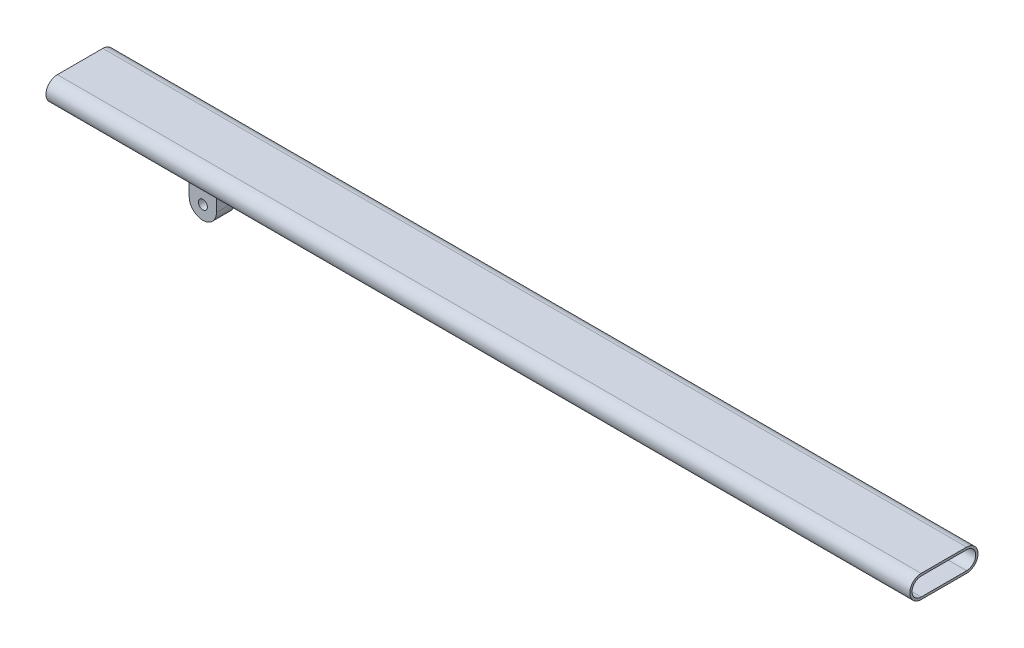
ISO-10303-21;
HEADER;
FILE_DESCRIPTION(('STEP AP214'),'2;1');
FILE_NAME('part.step','',(''),(''),'','','');
FILE_SCHEMA(('AUTOMOTIVE_DESIGN { 1 0 10303 214 1 1 1 1 }'));
ENDSEC;
DATA;
#1=APPLICATION_CONTEXT('core data for automotive mechanical design processes');
#2=APPLICATION_PROTOCOL_DEFINITION('international standard','automotive_design',2000,#1);
#3=PRODUCT_CONTEXT('',#1,'mechanical');
#4=PRODUCT('Part','Part','',(#3));
#5=PRODUCT_RELATED_PRODUCT_CATEGORY('part','',(#4));
#6=PRODUCT_DEFINITION_FORMATION('','',#4);
#7=PRODUCT_DEFINITION_CONTEXT('part definition',#1,'design');
#8=PRODUCT_DEFINITION('design','',#6,#7);
#9=PRODUCT_DEFINITION_SHAPE('','',#8);
#10=(LENGTH_UNIT() NAMED_UNIT(*) SI_UNIT(.MILLI.,.METRE.));
#11=(NAMED_UNIT(*) PLANE_ANGLE_UNIT() SI_UNIT($,.RADIAN.));
#12=(NAMED_UNIT(*) SI_UNIT($,.STERADIAN.) SOLID_ANGLE_UNIT());
#13=UNCERTAINTY_MEASURE_WITH_UNIT(LENGTH_MEASURE(1.E-05),#10,'distance_accuracy_value','');
#14=(GEOMETRIC_REPRESENTATION_CONTEXT(3) GLOBAL_UNCERTAINTY_ASSIGNED_CONTEXT((#13)) GLOBAL_UNIT_ASSIGNED_CONTEXT((#10,
#11,#12)) REPRESENTATION_CONTEXT('',''));
#15=CARTESIAN_POINT('',(0.,0.,0.));
#16=DIRECTION('',(0.,0.,1.));
#17=DIRECTION('',(1.,0.,0.));
#18=AXIS2_PLACEMENT_3D('',#15,#16,#17);
#19=CARTESIAN_POINT('',(73.,-4.5,0.));
#20=DIRECTION('',(0.,-1.,0.));
#21=DIRECTION('',(0.,0.,-1.));
#22=AXIS2_PLACEMENT_3D('',#19,#20,#21);
#23=PLANE('',#22);
#24=CARTESIAN_POINT('',(43.,-4.5,0.));
#25=DIRECTION('',(0.,-1.,0.));
#26=DIRECTION('',(0.,0.,-1.));
#27=AXIS2_PLACEMENT_3D('',#24,#25,#26);
#28=CIRCLE('',#27,0.755649999999997);
#29=CARTESIAN_POINT('',(43.,-4.5,-0.755649999999978));
#30=VERTEX_POINT('',#29);
#31=EDGE_CURVE('E631',#30,#30,#28,.T.);
#32=ORIENTED_EDGE('',*,*,#31,.F.);
#33=EDGE_LOOP('',(#32));
#34=FACE_BOUND('',#33,.T.);
#35=CARTESIAN_POINT('',(73.,-4.5,0.));
#36=DIRECTION('',(0.,-1.,0.));
#37=DIRECTION('',(0.,0.,-1.));
#38=AXIS2_PLACEMENT_3D('',#35,#36,#37);
#39=CIRCLE('',#38,0.755649999999997);
#40=CARTESIAN_POINT('',(73.,-4.5,-0.755649999999993));
#41=VERTEX_POINT('',#40);
#42=EDGE_CURVE('E636',#41,#41,#39,.T.);
#43=ORIENTED_EDGE('',*,*,#42,.F.);
#44=EDGE_LOOP('',(#43));
#45=FACE_BOUND('',#44,.T.);
#46=CARTESIAN_POINT('',(73.,-4.5,0.));
#47=DIRECTION('',(0.,-1.,0.));
#48=DIRECTION('',(0.,0.,-1.));
#49=AXIS2_PLACEMENT_3D('',#46,#47,#48);
#50=CIRCLE('',#49,5.);
#51=CARTESIAN_POINT('',(73.,-4.5,-5.));
#52=VERTEX_POINT('',#51);
#53=CARTESIAN_POINT('',(73.,-4.5,5.));
#54=VERTEX_POINT('',#53);
#55=EDGE_CURVE('E289',#52,#54,#50,.T.);
#56=ORIENTED_EDGE('',*,*,#55,.T.);
#57=DIRECTION('',(-1.,0.,0.));
#58=VECTOR('',#57,1.);
#59=CARTESIAN_POINT('',(73.,-4.5,5.));
#60=LINE('',#59,#58);
#61=CARTESIAN_POINT('',(43.,-4.5,5.00000000000002));
#62=VERTEX_POINT('',#61);
#63=EDGE_CURVE('E293',#54,#62,#60,.T.);
#64=ORIENTED_EDGE('',*,*,#63,.T.);
#65=CARTESIAN_POINT('',(43.,-4.5,0.));
#66=DIRECTION('',(0.,-1.,0.));
#67=DIRECTION('',(0.,0.,-1.));
#68=AXIS2_PLACEMENT_3D('',#65,#66,#67);
#69=CIRCLE('',#68,5.);
#70=CARTESIAN_POINT('',(43.,-4.5,-5.));
#71=VERTEX_POINT('',#70);
#72=EDGE_CURVE('E298',#62,#71,#69,.T.);
#73=ORIENTED_EDGE('',*,*,#72,.T.);
#74=DIRECTION('',(1.,0.,0.));
#75=VECTOR('',#74,1.);
#76=CARTESIAN_POINT('',(73.,-4.5,-5.));
#77=LINE('',#76,#75);
#78=EDGE_CURVE('E302',#71,#52,#77,.T.);
#79=ORIENTED_EDGE('',*,*,#78,.T.);
#80=EDGE_LOOP('',(#56,#64,#73,#79));
#81=FACE_BOUND('',#80,.T.);
#82=DIRECTION('',(1.,0.,0.));
#83=VECTOR('',#82,1.);
#84=CARTESIAN_POINT('',(64.,-4.5,-4.));
#85=LINE('',#84,#83);
#86=CARTESIAN_POINT('',(52.,-4.5,-4.));
#87=VERTEX_POINT('',#86);
#88=CARTESIAN_POINT('',(64.,-4.5,-4.));
#89=VERTEX_POINT('',#88);
#90=EDGE_CURVE('E264',#87,#89,#85,.T.);
#91=ORIENTED_EDGE('',*,*,#90,.F.);
#92=DIRECTION('',(0.,0.,-1.));
#93=VECTOR('',#92,1.);
#94=CARTESIAN_POINT('',(52.,-4.5,-4.));
#95=LINE('',#94,#93);
#96=CARTESIAN_POINT('',(52.,-4.5,4.));
#97=VERTEX_POINT('',#96);
#98=EDGE_CURVE('E260',#97,#87,#95,.T.);
#99=ORIENTED_EDGE('',*,*,#98,.F.);
#100=DIRECTION('',(-1.,0.,0.));
#101=VECTOR('',#100,1.);
#102=CARTESIAN_POINT('',(64.,-4.5,4.));
#103=LINE('',#102,#101);
#104=CARTESIAN_POINT('',(64.,-4.5,4.));
#105=VERTEX_POINT('',#104);
#106=EDGE_CURVE('E272',#105,#97,#103,.T.);
#107=ORIENTED_EDGE('',*,*,#106,.F.);
#108=DIRECTION('',(0.,0.,1.));
#109=VECTOR('',#108,1.);
#110=CARTESIAN_POINT('',(64.,-4.5,-4.));
#111=LINE('',#110,#109);
#112=EDGE_CURVE('E268',#89,#105,#111,.T.);
#113=ORIENTED_EDGE('',*,*,#112,.F.);
#114=EDGE_LOOP('',(#91,#99,#107,#113));
#115=FACE_BOUND('',#114,.T.);
#116=ADVANCED_FACE('F43',(#34,#45,#81,#115),#23,.T.);
#117=CARTESIAN_POINT('',(380.,0.,-10.));
#118=DIRECTION('',(-1.,0.,0.));
#119=DIRECTION('',(0.,0.,1.));
#120=AXIS2_PLACEMENT_3D('',#117,#118,#119);
#121=CYLINDRICAL_SURFACE('',#120,5.);
#122=CARTESIAN_POINT('',(0.,0.,-10.));
#123=DIRECTION('',(1.,0.,0.));
#124=DIRECTION('',(0.,0.,-1.));
#125=AXIS2_PLACEMENT_3D('',#122,#123,#124);
#126=CIRCLE('',#125,5.);
#127=CARTESIAN_POINT('',(0.,-5.,-10.));
#128=VERTEX_POINT('',#127);
#129=CARTESIAN_POINT('',(0.,5.,-10.));
#130=VERTEX_POINT('',#129);
#131=EDGE_CURVE('E323',#128,#130,#126,.T.);
#132=ORIENTED_EDGE('',*,*,#131,.T.);
#133=DIRECTION('',(-1.,0.,0.));
#134=VECTOR('',#133,1.);
#135=CARTESIAN_POINT('',(380.,5.,-10.));
#136=LINE('',#135,#134);
#137=CARTESIAN_POINT('',(380.,5.,-10.));
#138=VERTEX_POINT('',#137);
#139=EDGE_CURVE('E370',#138,#130,#136,.T.);
#140=ORIENTED_EDGE('',*,*,#139,.F.);
#141=CARTESIAN_POINT('',(380.,0.,-10.));
#142=DIRECTION('',(1.,0.,0.));
#143=DIRECTION('',(0.,0.,-1.));
#144=AXIS2_PLACEMENT_3D('',#141,#142,#143);
#145=CIRCLE('',#144,5.);
#146=CARTESIAN_POINT('',(380.,-5.,-10.));
#147=VERTEX_POINT('',#146);
#148=EDGE_CURVE('E333',#147,#138,#145,.T.);
#149=ORIENTED_EDGE('',*,*,#148,.F.);
#150=DIRECTION('',(-1.,0.,0.));
#151=VECTOR('',#150,1.);
#152=CARTESIAN_POINT('',(380.,-5.,-10.));
#153=LINE('',#152,#151);
#154=EDGE_CURVE('E347',#147,#128,#153,.T.);
#155=ORIENTED_EDGE('',*,*,#154,.T.);
#156=EDGE_LOOP('',(#132,#140,#149,#155));
#157=FACE_BOUND('',#156,.T.);
#158=ADVANCED_FACE('F437',(#157),#121,.T.);
#159=CARTESIAN_POINT('',(380.,5.,-10.));
#160=DIRECTION('',(0.,-1.,0.));
#161=DIRECTION('',(0.,0.,-1.));
#162=AXIS2_PLACEMENT_3D('',#159,#160,#161);
#163=PLANE('',#162);
#164=DIRECTION('',(0.,0.,1.));
#165=VECTOR('',#164,1.);
#166=CARTESIAN_POINT('',(0.,5.,-10.));
#167=LINE('',#166,#165);
#168=CARTESIAN_POINT('',(0.,5.,10.));
#169=VERTEX_POINT('',#168);
#170=EDGE_CURVE('E351',#130,#169,#167,.T.);
#171=ORIENTED_EDGE('',*,*,#170,.T.);
#172=DIRECTION('',(-1.,0.,0.));
#173=VECTOR('',#172,1.);
#174=CARTESIAN_POINT('',(380.,5.,10.));
#175=LINE('',#174,#173);
#176=CARTESIAN_POINT('',(380.,5.,10.));
#177=VERTEX_POINT('',#176);
#178=EDGE_CURVE('E366',#177,#169,#175,.T.);
#179=ORIENTED_EDGE('',*,*,#178,.F.);
#180=DIRECTION('',(0.,0.,1.));
#181=VECTOR('',#180,1.);
#182=CARTESIAN_POINT('',(380.,5.,-10.));
#183=LINE('',#182,#181);
#184=EDGE_CURVE('E337',#138,#177,#183,.T.);
#185=ORIENTED_EDGE('',*,*,#184,.F.);
#186=ORIENTED_EDGE('',*,*,#139,.T.);
#187=EDGE_LOOP('',(#171,#179,#185,#186));
#188=FACE_BOUND('',#187,.T.);
#189=ADVANCED_FACE('F443',(#188),#163,.F.);
#190=CARTESIAN_POINT('',(380.,0.,10.));
#191=DIRECTION('',(-1.,0.,0.));
#192=DIRECTION('',(0.,0.,1.));
#193=AXIS2_PLACEMENT_3D('',#190,#191,#192);
#194=CYLINDRICAL_SURFACE('',#193,5.);
#195=CARTESIAN_POINT('',(0.,0.,10.));
#196=DIRECTION('',(1.,0.,0.));
#197=DIRECTION('',(0.,0.,-1.));
#198=AXIS2_PLACEMENT_3D('',#195,#196,#197);
#199=CIRCLE('',#198,5.);
#200=CARTESIAN_POINT('',(0.,-5.,10.));
#201=VERTEX_POINT('',#200);
#202=EDGE_CURVE('E354',#169,#201,#199,.T.);
#203=ORIENTED_EDGE('',*,*,#202,.T.);
#204=DIRECTION('',(-1.,0.,0.));
#205=VECTOR('',#204,1.);
#206=CARTESIAN_POINT('',(380.,-5.,10.));
#207=LINE('',#206,#205);
#208=CARTESIAN_POINT('',(380.,-5.,10.));
#209=VERTEX_POINT('',#208);
#210=EDGE_CURVE('E362',#209,#201,#207,.T.);
#211=ORIENTED_EDGE('',*,*,#210,.F.);
#212=CARTESIAN_POINT('',(380.,0.,10.));
#213=DIRECTION('',(1.,0.,0.));
#214=DIRECTION('',(0.,0.,-1.));
#215=AXIS2_PLACEMENT_3D('',#212,#213,#214);
#216=CIRCLE('',#215,5.);
#217=EDGE_CURVE('E341',#177,#209,#216,.T.);
#218=ORIENTED_EDGE('',*,*,#217,.F.);
#219=ORIENTED_EDGE('',*,*,#178,.T.);
#220=EDGE_LOOP('',(#203,#211,#218,#219));
#221=FACE_BOUND('',#220,.T.);
#222=ADVANCED_FACE('F478',(#221),#194,.T.);
#223=CARTESIAN_POINT('',(380.,-5.,-10.));
#224=DIRECTION('',(0.,1.,0.));
#225=DIRECTION('',(0.,0.,1.));
#226=AXIS2_PLACEMENT_3D('',#223,#224,#225);
#227=PLANE('',#226);
#228=CARTESIAN_POINT('',(177.,-5.,0.));
#229=DIRECTION('',(0.,-1.,0.));
#230=DIRECTION('',(0.,0.,-1.));
#231=AXIS2_PLACEMENT_3D('',#228,#229,#230);
#232=CIRCLE('',#231,8.);
#233=CARTESIAN_POINT('',(177.,-5.,7.99999999999997));
#234=VERTEX_POINT('',#233);
#235=CARTESIAN_POINT('',(177.,-5.,-8.00000000000003));
#236=VERTEX_POINT('',#235);
#237=EDGE_CURVE('E199',#234,#236,#232,.T.);
#238=ORIENTED_EDGE('',*,*,#237,.F.);
#239=DIRECTION('',(-1.,0.,0.));
#240=VECTOR('',#239,1.);
#241=CARTESIAN_POINT('',(362.999999999999,-5.,8.));
#242=LINE('',#241,#240);
#243=CARTESIAN_POINT('',(362.999999999999,-5.,8.));
#244=VERTEX_POINT('',#243);
#245=EDGE_CURVE('E206',#244,#234,#242,.T.);
#246=ORIENTED_EDGE('',*,*,#245,.F.);
#247=CARTESIAN_POINT('',(362.999999999999,-5.,0.));
#248=DIRECTION('',(0.,-1.,0.));
#249=DIRECTION('',(0.,0.,-1.));
#250=AXIS2_PLACEMENT_3D('',#247,#248,#249);
#251=CIRCLE('',#250,8.);
#252=CARTESIAN_POINT('',(362.999999999999,-5.,-8.00000000000001));
#253=VERTEX_POINT('',#252);
#254=EDGE_CURVE('E211',#253,#244,#251,.T.);
#255=ORIENTED_EDGE('',*,*,#254,.F.);
#256=DIRECTION('',(1.,0.,0.));
#257=VECTOR('',#256,1.);
#258=CARTESIAN_POINT('',(362.999999999999,-5.,-8.));
#259=LINE('',#258,#257);
#260=EDGE_CURVE('E60',#236,#253,#259,.T.);
#261=ORIENTED_EDGE('',*,*,#260,.F.);
#262=EDGE_LOOP('',(#238,#246,#255,#261));
#263=FACE_BOUND('',#262,.T.);
#264=DIRECTION('',(-1.,0.,0.));
#265=VECTOR('',#264,1.);
#266=CARTESIAN_POINT('',(73.,-5.,5.));
#267=LINE('',#266,#265);
#268=CARTESIAN_POINT('',(73.,-5.,5.));
#269=VERTEX_POINT('',#268);
#270=CARTESIAN_POINT('',(43.,-5.,5.00000000000002));
#271=VERTEX_POINT('',#270);
#272=EDGE_CURVE('E309',#269,#271,#267,.T.);
#273=ORIENTED_EDGE('',*,*,#272,.F.);
#274=CARTESIAN_POINT('',(73.,-5.,0.));
#275=DIRECTION('',(0.,-1.,0.));
#276=DIRECTION('',(0.,0.,-1.));
#277=AXIS2_PLACEMENT_3D('',#274,#275,#276);
#278=CIRCLE('',#277,5.);
#279=CARTESIAN_POINT('',(73.,-5.,-5.));
#280=VERTEX_POINT('',#279);
#281=EDGE_CURVE('E288',#280,#269,#278,.T.);
#282=ORIENTED_EDGE('',*,*,#281,.F.);
#283=DIRECTION('',(1.,0.,0.));
#284=VECTOR('',#283,1.);
#285=CARTESIAN_POINT('',(73.,-5.,-5.));
#286=LINE('',#285,#284);
#287=CARTESIAN_POINT('',(43.,-5.,-5.));
#288=VERTEX_POINT('',#287);
#289=EDGE_CURVE('E294',#288,#280,#286,.T.);
#290=ORIENTED_EDGE('',*,*,#289,.F.);
#291=CARTESIAN_POINT('',(43.,-5.,0.));
#292=DIRECTION('',(0.,-1.,0.));
#293=DIRECTION('',(0.,0.,-1.));
#294=AXIS2_PLACEMENT_3D('',#291,#292,#293);
#295=CIRCLE('',#294,5.);
#296=EDGE_CURVE('E313',#271,#288,#295,.T.);
#297=ORIENTED_EDGE('',*,*,#296,.F.);
#298=EDGE_LOOP('',(#273,#282,#290,#297));
#299=FACE_BOUND('',#298,.T.);
#300=DIRECTION('',(0.,0.,-1.));
#301=VECTOR('',#300,1.);
#302=CARTESIAN_POINT('',(0.,-5.,-10.));
#303=LINE('',#302,#301);
#304=EDGE_CURVE('E338',#201,#128,#303,.T.);
#305=ORIENTED_EDGE('',*,*,#304,.T.);
#306=ORIENTED_EDGE('',*,*,#154,.F.);
#307=DIRECTION('',(0.,0.,-1.));
#308=VECTOR('',#307,1.);
#309=CARTESIAN_POINT('',(380.,-5.,-10.));
#310=LINE('',#309,#308);
#311=EDGE_CURVE('E344',#209,#147,#310,.T.);
#312=ORIENTED_EDGE('',*,*,#311,.F.);
#313=ORIENTED_EDGE('',*,*,#210,.T.);
#314=EDGE_LOOP('',(#305,#306,#312,#313));
#315=FACE_BOUND('',#314,.T.);
#316=ADVANCED_FACE('F209',(#263,#299,#315),#227,.F.);
#317=CARTESIAN_POINT('',(380.,0.,-10.));
#318=DIRECTION('',(1.,0.,0.));
#319=DIRECTION('',(0.,0.,-1.));
#320=AXIS2_PLACEMENT_3D('',#317,#318,#319);
#321=PLANE('',#320);
#322=CARTESIAN_POINT('',(380.,0.,-10.));
#323=DIRECTION('',(-1.,0.,0.));
#324=DIRECTION('',(0.,0.,1.));
#325=AXIS2_PLACEMENT_3D('',#322,#323,#324);
#326=CIRCLE('',#325,4.);
#327=CARTESIAN_POINT('',(380.,4.00000000000001,-10.));
#328=VERTEX_POINT('',#327);
#329=CARTESIAN_POINT('',(380.,-4.,-10.));
#330=VERTEX_POINT('',#329);
#331=EDGE_CURVE('E228',#328,#330,#326,.T.);
#332=ORIENTED_EDGE('',*,*,#331,.T.);
#333=DIRECTION('',(0.,0.,1.));
#334=VECTOR('',#333,1.);
#335=CARTESIAN_POINT('',(380.,-4.,-10.));
#336=LINE('',#335,#334);
#337=CARTESIAN_POINT('',(380.,-4.,10.));
#338=VERTEX_POINT('',#337);
#339=EDGE_CURVE('E232',#330,#338,#336,.T.);
#340=ORIENTED_EDGE('',*,*,#339,.T.);
#341=CARTESIAN_POINT('',(380.,0.,10.));
#342=DIRECTION('',(-1.,0.,0.));
#343=DIRECTION('',(0.,0.,1.));
#344=AXIS2_PLACEMENT_3D('',#341,#342,#343);
#345=CIRCLE('',#344,4.);
#346=CARTESIAN_POINT('',(380.,4.,10.));
#347=VERTEX_POINT('',#346);
#348=EDGE_CURVE('E236',#338,#347,#345,.T.);
#349=ORIENTED_EDGE('',*,*,#348,.T.);
#350=DIRECTION('',(0.,0.,-1.));
#351=VECTOR('',#350,1.);
#352=CARTESIAN_POINT('',(380.,4.,10.));
#353=LINE('',#352,#351);
#354=EDGE_CURVE('E240',#347,#328,#353,.T.);
#355=ORIENTED_EDGE('',*,*,#354,.T.);
#356=EDGE_LOOP('',(#332,#340,#349,#355));
#357=FACE_BOUND('',#356,.T.);
#358=ORIENTED_EDGE('',*,*,#148,.T.);
#359=ORIENTED_EDGE('',*,*,#184,.T.);
#360=ORIENTED_EDGE('',*,*,#217,.T.);
#361=ORIENTED_EDGE('',*,*,#311,.T.);
#362=EDGE_LOOP('',(#358,#359,#360,#361));
#363=FACE_BOUND('',#362,.T.);
#364=ADVANCED_FACE('F469',(#357,#363),#321,.T.);
#365=CARTESIAN_POINT('',(0.,0.,-10.));
#366=DIRECTION('',(1.,0.,0.));
#367=DIRECTION('',(0.,0.,-1.));
#368=AXIS2_PLACEMENT_3D('',#365,#366,#367);
#369=PLANE('',#368);
#370=DIRECTION('',(0.,0.,-1.));
#371=VECTOR('',#370,1.);
#372=CARTESIAN_POINT('',(0.,-4.,-10.));
#373=LINE('',#372,#371);
#374=CARTESIAN_POINT('',(0.,-4.,10.));
#375=VERTEX_POINT('',#374);
#376=CARTESIAN_POINT('',(0.,-4.,-10.));
#377=VERTEX_POINT('',#376);
#378=EDGE_CURVE('E393',#375,#377,#373,.T.);
#379=ORIENTED_EDGE('',*,*,#378,.T.);
#380=CARTESIAN_POINT('',(0.,0.,-10.));
#381=DIRECTION('',(-1.,0.,0.));
#382=DIRECTION('',(0.,0.,1.));
#383=AXIS2_PLACEMENT_3D('',#380,#381,#382);
#384=CIRCLE('',#383,4.);
#385=CARTESIAN_POINT('',(0.,4.00000000000001,-10.));
#386=VERTEX_POINT('',#385);
#387=EDGE_CURVE('E408',#377,#386,#384,.F.);
#388=ORIENTED_EDGE('',*,*,#387,.T.);
#389=DIRECTION('',(0.,0.,-1.));
#390=VECTOR('',#389,1.);
#391=CARTESIAN_POINT('',(0.,4.00000000000001,-10.));
#392=LINE('',#391,#390);
#393=CARTESIAN_POINT('',(0.,4.,10.));
#394=VERTEX_POINT('',#393);
#395=EDGE_CURVE('E404',#386,#394,#392,.F.);
#396=ORIENTED_EDGE('',*,*,#395,.T.);
#397=CARTESIAN_POINT('',(0.,0.,10.));
#398=DIRECTION('',(-1.,0.,0.));
#399=DIRECTION('',(0.,0.,1.));
#400=AXIS2_PLACEMENT_3D('',#397,#398,#399);
#401=CIRCLE('',#400,4.);
#402=EDGE_CURVE('E400',#394,#375,#401,.F.);
#403=ORIENTED_EDGE('',*,*,#402,.T.);
#404=EDGE_LOOP('',(#379,#388,#396,#403));
#405=FACE_BOUND('',#404,.T.);
#406=ORIENTED_EDGE('',*,*,#131,.F.);
#407=ORIENTED_EDGE('',*,*,#304,.F.);
#408=ORIENTED_EDGE('',*,*,#202,.F.);
#409=ORIENTED_EDGE('',*,*,#170,.F.);
#410=EDGE_LOOP('',(#406,#407,#408,#409));
#411=FACE_BOUND('',#410,.T.);
#412=ADVANCED_FACE('F467',(#405,#411),#369,.F.);
#413=CARTESIAN_POINT('',(73.,-4.5,0.));
#414=DIRECTION('',(0.,-1.,0.));
#415=DIRECTION('',(0.,0.,-1.));
#416=AXIS2_PLACEMENT_3D('',#413,#414,#415);
#417=CYLINDRICAL_SURFACE('',#416,5.);
#418=ORIENTED_EDGE('',*,*,#281,.T.);
#419=DIRECTION('',(0.,-1.,0.));
#420=VECTOR('',#419,1.);
#421=CARTESIAN_POINT('',(73.,-4.5,5.));
#422=LINE('',#421,#420);
#423=EDGE_CURVE('E306',#54,#269,#422,.T.);
#424=ORIENTED_EDGE('',*,*,#423,.F.);
#425=ORIENTED_EDGE('',*,*,#55,.F.);
#426=DIRECTION('',(0.,-1.,0.));
#427=VECTOR('',#426,1.);
#428=CARTESIAN_POINT('',(73.,-4.5,-5.));
#429=LINE('',#428,#427);
#430=EDGE_CURVE('E320',#52,#280,#429,.T.);
#431=ORIENTED_EDGE('',*,*,#430,.T.);
#432=EDGE_LOOP('',(#418,#424,#425,#431));
#433=FACE_BOUND('',#432,.T.);
#434=ADVANCED_FACE('F456',(#433),#417,.F.);
#435=CARTESIAN_POINT('',(73.,-4.5,-5.));
#436=DIRECTION('',(0.,0.,-1.));
#437=DIRECTION('',(0.,1.,0.));
#438=AXIS2_PLACEMENT_3D('',#435,#436,#437);
#439=PLANE('',#438);
#440=ORIENTED_EDGE('',*,*,#289,.T.);
#441=ORIENTED_EDGE('',*,*,#430,.F.);
#442=ORIENTED_EDGE('',*,*,#78,.F.);
#443=DIRECTION('',(0.,-1.,0.));
#444=VECTOR('',#443,1.);
#445=CARTESIAN_POINT('',(43.,-4.5,-5.));
#446=LINE('',#445,#444);
#447=EDGE_CURVE('E324',#71,#288,#446,.T.);
#448=ORIENTED_EDGE('',*,*,#447,.T.);
#449=EDGE_LOOP('',(#440,#441,#442,#448));
#450=FACE_BOUND('',#449,.T.);
#451=ADVANCED_FACE('F452',(#450),#439,.F.);
#452=CARTESIAN_POINT('',(43.,-4.5,0.));
#453=DIRECTION('',(0.,-1.,0.));
#454=DIRECTION('',(0.,0.,-1.));
#455=AXIS2_PLACEMENT_3D('',#452,#453,#454);
#456=CYLINDRICAL_SURFACE('',#455,5.);
#457=ORIENTED_EDGE('',*,*,#296,.T.);
#458=ORIENTED_EDGE('',*,*,#447,.F.);
#459=ORIENTED_EDGE('',*,*,#72,.F.);
#460=DIRECTION('',(0.,-1.,0.));
#461=VECTOR('',#460,1.);
#462=CARTESIAN_POINT('',(43.,-4.5,5.00000000000002));
#463=LINE('',#462,#461);
#464=EDGE_CURVE('E327',#62,#271,#463,.T.);
#465=ORIENTED_EDGE('',*,*,#464,.T.);
#466=EDGE_LOOP('',(#457,#458,#459,#465));
#467=FACE_BOUND('',#466,.T.);
#468=ADVANCED_FACE('F455',(#467),#456,.F.);
#469=CARTESIAN_POINT('',(73.,-4.5,5.));
#470=DIRECTION('',(0.,0.,1.));
#471=DIRECTION('',(0.,-1.,0.));
#472=AXIS2_PLACEMENT_3D('',#469,#470,#471);
#473=PLANE('',#472);
#474=ORIENTED_EDGE('',*,*,#272,.T.);
#475=ORIENTED_EDGE('',*,*,#464,.F.);
#476=ORIENTED_EDGE('',*,*,#63,.F.);
#477=ORIENTED_EDGE('',*,*,#423,.T.);
#478=EDGE_LOOP('',(#474,#475,#476,#477));
#479=FACE_BOUND('',#478,.T.);
#480=ADVANCED_FACE('F460',(#479),#473,.F.);
#481=CARTESIAN_POINT('',(52.,-24.5,-4.));
#482=DIRECTION('',(1.,0.,0.));
#483=DIRECTION('',(0.,0.,-1.));
#484=AXIS2_PLACEMENT_3D('',#481,#482,#483);
#485=PLANE('',#484);
#486=DIRECTION('',(0.,1.,0.));
#487=VECTOR('',#486,1.);
#488=CARTESIAN_POINT('',(52.,-24.5,-4.));
#489=LINE('',#488,#487);
#490=CARTESIAN_POINT('',(52.,-18.5,-4.));
#491=VERTEX_POINT('',#490);
#492=EDGE_CURVE('E285',#491,#87,#489,.T.);
#493=ORIENTED_EDGE('',*,*,#492,.F.);
#494=DIRECTION('',(0.,0.,-1.));
#495=VECTOR('',#494,1.);
#496=CARTESIAN_POINT('',(52.,-18.5,4.));
#497=LINE('',#496,#495);
#498=CARTESIAN_POINT('',(52.,-18.5,4.));
#499=VERTEX_POINT('',#498);
#500=EDGE_CURVE('E390',#491,#499,#497,.F.);
#501=ORIENTED_EDGE('',*,*,#500,.T.);
#502=DIRECTION('',(0.,1.,0.));
#503=VECTOR('',#502,1.);
#504=CARTESIAN_POINT('',(52.,-24.5,4.));
#505=LINE('',#504,#503);
#506=EDGE_CURVE('E276',#499,#97,#505,.T.);
#507=ORIENTED_EDGE('',*,*,#506,.T.);
#508=ORIENTED_EDGE('',*,*,#98,.T.);
#509=EDGE_LOOP('',(#493,#501,#507,#508));
#510=FACE_BOUND('',#509,.T.);
#511=ADVANCED_FACE('F450',(#510),#485,.F.);
#512=CARTESIAN_POINT('',(64.,-24.5,-4.));
#513=DIRECTION('',(0.,0.,1.));
#514=DIRECTION('',(1.,0.,0.));
#515=AXIS2_PLACEMENT_3D('',#512,#513,#514);
#516=PLANE('',#515);
#517=CARTESIAN_POINT('',(58.,-18.5,-4.));
#518=DIRECTION('',(0.,0.,1.));
#519=DIRECTION('',(1.,0.,0.));
#520=AXIS2_PLACEMENT_3D('',#517,#518,#519);
#521=CIRCLE('',#520,2.);
#522=CARTESIAN_POINT('',(60.,-18.5,-4.));
#523=VERTEX_POINT('',#522);
#524=EDGE_CURVE('E217',#523,#523,#521,.T.);
#525=ORIENTED_EDGE('',*,*,#524,.T.);
#526=EDGE_LOOP('',(#525));
#527=FACE_BOUND('',#526,.T.);
#528=DIRECTION('',(0.,1.,0.));
#529=VECTOR('',#528,1.);
#530=CARTESIAN_POINT('',(64.,-24.5,-4.));
#531=LINE('',#530,#529);
#532=CARTESIAN_POINT('',(64.,-18.5,-4.));
#533=VERTEX_POINT('',#532);
#534=EDGE_CURVE('E282',#533,#89,#531,.T.);
#535=ORIENTED_EDGE('',*,*,#534,.F.);
#536=CARTESIAN_POINT('',(58.,-18.5,-4.));
#537=DIRECTION('',(0.,0.,1.));
#538=DIRECTION('',(1.,0.,0.));
#539=AXIS2_PLACEMENT_3D('',#536,#537,#538);
#540=CIRCLE('',#539,6.);
#541=CARTESIAN_POINT('',(58.,-24.5,-4.));
#542=VERTEX_POINT('',#541);
#543=EDGE_CURVE('E387',#533,#542,#540,.F.);
#544=ORIENTED_EDGE('',*,*,#543,.T.);
#545=CARTESIAN_POINT('',(58.,-18.5,-4.));
#546=DIRECTION('',(0.,0.,1.));
#547=DIRECTION('',(1.,0.,0.));
#548=AXIS2_PLACEMENT_3D('',#545,#546,#547);
#549=CIRCLE('',#548,6.);
#550=EDGE_CURVE('E384',#542,#491,#549,.F.);
#551=ORIENTED_EDGE('',*,*,#550,.T.);
#552=ORIENTED_EDGE('',*,*,#492,.T.);
#553=ORIENTED_EDGE('',*,*,#90,.T.);
#554=EDGE_LOOP('',(#535,#544,#551,#552,#553));
#555=FACE_BOUND('',#554,.T.);
#556=ADVANCED_FACE('F506',(#527,#555),#516,.F.);
#557=CARTESIAN_POINT('',(64.,-24.5,-4.));
#558=DIRECTION('',(-1.,0.,0.));
#559=DIRECTION('',(0.,0.,1.));
#560=AXIS2_PLACEMENT_3D('',#557,#558,#559);
#561=PLANE('',#560);
#562=DIRECTION('',(0.,1.,0.));
#563=VECTOR('',#562,1.);
#564=CARTESIAN_POINT('',(64.,-24.5,4.));
#565=LINE('',#564,#563);
#566=CARTESIAN_POINT('',(64.,-18.5,4.));
#567=VERTEX_POINT('',#566);
#568=EDGE_CURVE('E279',#567,#105,#565,.T.);
#569=ORIENTED_EDGE('',*,*,#568,.F.);
#570=DIRECTION('',(0.,0.,1.));
#571=VECTOR('',#570,1.);
#572=CARTESIAN_POINT('',(64.,-18.5,-4.));
#573=LINE('',#572,#571);
#574=EDGE_CURVE('E380',#567,#533,#573,.F.);
#575=ORIENTED_EDGE('',*,*,#574,.T.);
#576=ORIENTED_EDGE('',*,*,#534,.T.);
#577=ORIENTED_EDGE('',*,*,#112,.T.);
#578=EDGE_LOOP('',(#569,#575,#576,#577));
#579=FACE_BOUND('',#578,.T.);
#580=ADVANCED_FACE('F505',(#579),#561,.F.);
#581=CARTESIAN_POINT('',(64.,-24.5,4.));
#582=DIRECTION('',(0.,0.,-1.));
#583=DIRECTION('',(-1.,0.,0.));
#584=AXIS2_PLACEMENT_3D('',#581,#582,#583);
#585=PLANE('',#584);
#586=CARTESIAN_POINT('',(58.,-18.5,4.));
#587=DIRECTION('',(0.,0.,-1.));
#588=DIRECTION('',(-1.,0.,0.));
#589=AXIS2_PLACEMENT_3D('',#586,#587,#588);
#590=CIRCLE('',#589,2.);
#591=CARTESIAN_POINT('',(56.,-18.5,4.));
#592=VERTEX_POINT('',#591);
#593=EDGE_CURVE('E47',#592,#592,#590,.T.);
#594=ORIENTED_EDGE('',*,*,#593,.T.);
#595=EDGE_LOOP('',(#594));
#596=FACE_BOUND('',#595,.T.);
#597=CARTESIAN_POINT('',(58.,-18.5,4.));
#598=DIRECTION('',(0.,0.,-1.));
#599=DIRECTION('',(-1.,0.,0.));
#600=AXIS2_PLACEMENT_3D('',#597,#598,#599);
#601=CIRCLE('',#600,6.);
#602=CARTESIAN_POINT('',(58.,-24.5,4.));
#603=VERTEX_POINT('',#602);
#604=EDGE_CURVE('E374',#499,#603,#601,.F.);
#605=ORIENTED_EDGE('',*,*,#604,.T.);
#606=CARTESIAN_POINT('',(58.,-18.5,4.));
#607=DIRECTION('',(0.,0.,-1.));
#608=DIRECTION('',(-1.,0.,0.));
#609=AXIS2_PLACEMENT_3D('',#606,#607,#608);
#610=CIRCLE('',#609,6.);
#611=EDGE_CURVE('E377',#603,#567,#610,.F.);
#612=ORIENTED_EDGE('',*,*,#611,.T.);
#613=ORIENTED_EDGE('',*,*,#568,.T.);
#614=ORIENTED_EDGE('',*,*,#106,.T.);
#615=ORIENTED_EDGE('',*,*,#506,.F.);
#616=EDGE_LOOP('',(#605,#612,#613,#614,#615));
#617=FACE_BOUND('',#616,.T.);
#618=ADVANCED_FACE('F495',(#596,#617),#585,.F.);
#619=CARTESIAN_POINT('',(58.,-18.5,0.));
#620=DIRECTION('',(0.,0.,1.));
#621=DIRECTION('',(0.,-1.,0.));
#622=AXIS2_PLACEMENT_3D('',#619,#620,#621);
#623=CYLINDRICAL_SURFACE('',#622,6.);
#624=ORIENTED_EDGE('',*,*,#500,.F.);
#625=ORIENTED_EDGE('',*,*,#550,.F.);
#626=DIRECTION('',(0.,0.,-1.));
#627=VECTOR('',#626,1.);
#628=CARTESIAN_POINT('',(58.,-24.5,-4.));
#629=LINE('',#628,#627);
#630=EDGE_CURVE('E254',#603,#542,#629,.T.);
#631=ORIENTED_EDGE('',*,*,#630,.F.);
#632=ORIENTED_EDGE('',*,*,#604,.F.);
#633=EDGE_LOOP('',(#624,#625,#631,#632));
#634=FACE_BOUND('',#633,.T.);
#635=ADVANCED_FACE('F45',(#634),#623,.T.);
#636=CARTESIAN_POINT('',(58.,-18.5,0.));
#637=DIRECTION('',(0.,0.,-1.));
#638=DIRECTION('',(0.,1.,0.));
#639=AXIS2_PLACEMENT_3D('',#636,#637,#638);
#640=CYLINDRICAL_SURFACE('',#639,6.);
#641=ORIENTED_EDGE('',*,*,#543,.F.);
#642=ORIENTED_EDGE('',*,*,#574,.F.);
#643=ORIENTED_EDGE('',*,*,#611,.F.);
#644=ORIENTED_EDGE('',*,*,#630,.T.);
#645=EDGE_LOOP('',(#641,#642,#643,#644));
#646=FACE_BOUND('',#645,.T.);
#647=ADVANCED_FACE('F484',(#646),#640,.T.);
#648=CARTESIAN_POINT('',(380.,0.,-10.));
#649=DIRECTION('',(-1.,0.,0.));
#650=DIRECTION('',(0.,0.,1.));
#651=AXIS2_PLACEMENT_3D('',#648,#649,#650);
#652=CYLINDRICAL_SURFACE('',#651,4.);
#653=DIRECTION('',(-1.,0.,0.));
#654=VECTOR('',#653,1.);
#655=CARTESIAN_POINT('',(380.,-4.,-10.));
#656=LINE('',#655,#654);
#657=EDGE_CURVE('E244',#330,#377,#656,.T.);
#658=ORIENTED_EDGE('',*,*,#657,.F.);
#659=ORIENTED_EDGE('',*,*,#331,.F.);
#660=DIRECTION('',(-1.,0.,0.));
#661=VECTOR('',#660,1.);
#662=CARTESIAN_POINT('',(380.,4.00000000000001,-10.));
#663=LINE('',#662,#661);
#664=EDGE_CURVE('E249',#328,#386,#663,.T.);
#665=ORIENTED_EDGE('',*,*,#664,.T.);
#666=ORIENTED_EDGE('',*,*,#387,.F.);
#667=EDGE_LOOP('',(#658,#659,#665,#666));
#668=FACE_BOUND('',#667,.T.);
#669=ADVANCED_FACE('F486',(#668),#652,.F.);
#670=CARTESIAN_POINT('',(380.,4.,10.));
#671=DIRECTION('',(0.,1.,0.));
#672=DIRECTION('',(0.,0.,1.));
#673=AXIS2_PLACEMENT_3D('',#670,#671,#672);
#674=PLANE('',#673);
#675=ORIENTED_EDGE('',*,*,#664,.F.);
#676=ORIENTED_EDGE('',*,*,#354,.F.);
#677=DIRECTION('',(-1.,0.,0.));
#678=VECTOR('',#677,1.);
#679=CARTESIAN_POINT('',(380.,4.,10.));
#680=LINE('',#679,#678);
#681=EDGE_CURVE('E245',#347,#394,#680,.T.);
#682=ORIENTED_EDGE('',*,*,#681,.T.);
#683=ORIENTED_EDGE('',*,*,#395,.F.);
#684=EDGE_LOOP('',(#675,#676,#682,#683));
#685=FACE_BOUND('',#684,.T.);
#686=ADVANCED_FACE('F492',(#685),#674,.F.);
#687=CARTESIAN_POINT('',(380.,0.,10.));
#688=DIRECTION('',(-1.,0.,0.));
#689=DIRECTION('',(0.,0.,1.));
#690=AXIS2_PLACEMENT_3D('',#687,#688,#689);
#691=CYLINDRICAL_SURFACE('',#690,4.);
#692=ORIENTED_EDGE('',*,*,#681,.F.);
#693=ORIENTED_EDGE('',*,*,#348,.F.);
#694=DIRECTION('',(-1.,0.,0.));
#695=VECTOR('',#694,1.);
#696=CARTESIAN_POINT('',(380.,-4.,10.));
#697=LINE('',#696,#695);
#698=EDGE_CURVE('E250',#338,#375,#697,.T.);
#699=ORIENTED_EDGE('',*,*,#698,.T.);
#700=ORIENTED_EDGE('',*,*,#402,.F.);
#701=EDGE_LOOP('',(#692,#693,#699,#700));
#702=FACE_BOUND('',#701,.T.);
#703=ADVANCED_FACE('F534',(#702),#691,.F.);
#704=CARTESIAN_POINT('',(380.,-4.,-10.));
#705=DIRECTION('',(0.,-1.,0.));
#706=DIRECTION('',(0.,0.,-1.));
#707=AXIS2_PLACEMENT_3D('',#704,#705,#706);
#708=PLANE('',#707);
#709=CARTESIAN_POINT('',(43.,-4.,0.));
#710=DIRECTION('',(0.,-1.,0.));
#711=DIRECTION('',(0.,0.,-1.));
#712=AXIS2_PLACEMENT_3D('',#709,#710,#711);
#713=CIRCLE('',#712,0.755649999999997);
#714=CARTESIAN_POINT('',(43.,-4.,-0.755649999999978));
#715=VERTEX_POINT('',#714);
#716=EDGE_CURVE('E634',#715,#715,#713,.T.);
#717=ORIENTED_EDGE('',*,*,#716,.T.);
#718=EDGE_LOOP('',(#717));
#719=FACE_BOUND('',#718,.T.);
#720=CARTESIAN_POINT('',(73.,-4.,0.));
#721=DIRECTION('',(0.,-1.,0.));
#722=DIRECTION('',(0.,0.,-1.));
#723=AXIS2_PLACEMENT_3D('',#720,#721,#722);
#724=CIRCLE('',#723,0.755649999999997);
#725=CARTESIAN_POINT('',(73.,-4.,-0.755649999999993));
#726=VERTEX_POINT('',#725);
#727=EDGE_CURVE('E641',#726,#726,#724,.T.);
#728=ORIENTED_EDGE('',*,*,#727,.T.);
#729=EDGE_LOOP('',(#728));
#730=FACE_BOUND('',#729,.T.);
#731=CARTESIAN_POINT('',(362.999999999999,-4.,0.));
#732=DIRECTION('',(0.,-1.,0.));
#733=DIRECTION('',(0.,0.,-1.));
#734=AXIS2_PLACEMENT_3D('',#731,#732,#733);
#735=CIRCLE('',#734,8.);
#736=CARTESIAN_POINT('',(362.999999999999,-4.,-8.));
#737=VERTEX_POINT('',#736);
#738=CARTESIAN_POINT('',(362.999999999999,-4.00000000000001,8.));
#739=VERTEX_POINT('',#738);
#740=EDGE_CURVE('E412',#737,#739,#735,.T.);
#741=ORIENTED_EDGE('',*,*,#740,.T.);
#742=DIRECTION('',(-1.,0.,0.));
#743=VECTOR('',#742,1.);
#744=CARTESIAN_POINT('',(380.,-4.,8.));
#745=LINE('',#744,#743);
#746=CARTESIAN_POINT('',(177.,-4.,7.99999999999997));
#747=VERTEX_POINT('',#746);
#748=EDGE_CURVE('E11',#739,#747,#745,.T.);
#749=ORIENTED_EDGE('',*,*,#748,.T.);
#750=CARTESIAN_POINT('',(177.,-4.,0.));
#751=DIRECTION('',(0.,-1.,0.));
#752=DIRECTION('',(0.,0.,-1.));
#753=AXIS2_PLACEMENT_3D('',#750,#751,#752);
#754=CIRCLE('',#753,8.);
#755=CARTESIAN_POINT('',(177.,-4.,-8.00000000000003));
#756=VERTEX_POINT('',#755);
#757=EDGE_CURVE('E53',#747,#756,#754,.T.);
#758=ORIENTED_EDGE('',*,*,#757,.T.);
#759=DIRECTION('',(1.,0.,0.));
#760=VECTOR('',#759,1.);
#761=CARTESIAN_POINT('',(380.,-4.,-8.));
#762=LINE('',#761,#760);
#763=EDGE_CURVE('E191',#756,#737,#762,.T.);
#764=ORIENTED_EDGE('',*,*,#763,.T.);
#765=EDGE_LOOP('',(#741,#749,#758,#764));
#766=FACE_BOUND('',#765,.T.);
#767=ORIENTED_EDGE('',*,*,#698,.F.);
#768=ORIENTED_EDGE('',*,*,#339,.F.);
#769=ORIENTED_EDGE('',*,*,#657,.T.);
#770=ORIENTED_EDGE('',*,*,#378,.F.);
#771=EDGE_LOOP('',(#767,#768,#769,#770));
#772=FACE_BOUND('',#771,.T.);
#773=ADVANCED_FACE('F420',(#719,#730,#766,#772),#708,.F.);
#774=CARTESIAN_POINT('',(362.999999999999,206.632672587616,8.00000000000003));
#775=DIRECTION('',(0.,0.,1.));
#776=DIRECTION('',(1.,0.,0.));
#777=AXIS2_PLACEMENT_3D('',#774,#775,#776);
#778=PLANE('',#777);
#779=DIRECTION('',(0.,-1.,0.));
#780=VECTOR('',#779,1.);
#781=CARTESIAN_POINT('',(362.999999999999,206.632672587616,8.00000000000003));
#782=LINE('',#781,#780);
#783=EDGE_CURVE('E68',#739,#244,#782,.T.);
#784=ORIENTED_EDGE('',*,*,#783,.T.);
#785=ORIENTED_EDGE('',*,*,#245,.T.);
#786=DIRECTION('',(0.,-1.,0.));
#787=VECTOR('',#786,1.);
#788=CARTESIAN_POINT('',(177.,206.632672587616,8.));
#789=LINE('',#788,#787);
#790=EDGE_CURVE('E196',#747,#234,#789,.T.);
#791=ORIENTED_EDGE('',*,*,#790,.F.);
#792=ORIENTED_EDGE('',*,*,#748,.F.);
#793=EDGE_LOOP('',(#784,#785,#791,#792));
#794=FACE_BOUND('',#793,.T.);
#795=ADVANCED_FACE('F423',(#794),#778,.F.);
#796=CARTESIAN_POINT('',(177.,206.632672587616,0.));
#797=DIRECTION('',(0.,-1.,0.));
#798=DIRECTION('',(0.,0.,-1.));
#799=AXIS2_PLACEMENT_3D('',#796,#797,#798);
#800=CYLINDRICAL_SURFACE('',#799,8.);
#801=ORIENTED_EDGE('',*,*,#790,.T.);
#802=ORIENTED_EDGE('',*,*,#237,.T.);
#803=DIRECTION('',(0.,-1.,0.));
#804=VECTOR('',#803,1.);
#805=CARTESIAN_POINT('',(177.,206.632672587616,-8.));
#806=LINE('',#805,#804);
#807=EDGE_CURVE('E187',#756,#236,#806,.T.);
#808=ORIENTED_EDGE('',*,*,#807,.F.);
#809=ORIENTED_EDGE('',*,*,#757,.F.);
#810=EDGE_LOOP('',(#801,#802,#808,#809));
#811=FACE_BOUND('',#810,.T.);
#812=ADVANCED_FACE('F200',(#811),#800,.F.);
#813=CARTESIAN_POINT('',(362.999999999999,206.632672587616,-7.99999999999998));
#814=DIRECTION('',(0.,0.,-1.));
#815=DIRECTION('',(0.,1.,0.));
#816=AXIS2_PLACEMENT_3D('',#813,#814,#815);
#817=PLANE('',#816);
#818=ORIENTED_EDGE('',*,*,#807,.T.);
#819=ORIENTED_EDGE('',*,*,#260,.T.);
#820=DIRECTION('',(0.,-1.,0.));
#821=VECTOR('',#820,1.);
#822=CARTESIAN_POINT('',(362.999999999999,206.632672587616,-7.99999999999998));
#823=LINE('',#822,#821);
#824=EDGE_CURVE('E195',#737,#253,#823,.T.);
#825=ORIENTED_EDGE('',*,*,#824,.F.);
#826=ORIENTED_EDGE('',*,*,#763,.F.);
#827=EDGE_LOOP('',(#818,#819,#825,#826));
#828=FACE_BOUND('',#827,.T.);
#829=ADVANCED_FACE('F189',(#828),#817,.F.);
#830=CARTESIAN_POINT('',(362.999999999999,206.632672587616,0.));
#831=DIRECTION('',(0.,-1.,0.));
#832=DIRECTION('',(0.,0.,-1.));
#833=AXIS2_PLACEMENT_3D('',#830,#831,#832);
#834=CYLINDRICAL_SURFACE('',#833,8.);
#835=ORIENTED_EDGE('',*,*,#824,.T.);
#836=ORIENTED_EDGE('',*,*,#254,.T.);
#837=ORIENTED_EDGE('',*,*,#783,.F.);
#838=ORIENTED_EDGE('',*,*,#740,.F.);
#839=EDGE_LOOP('',(#835,#836,#837,#838));
#840=FACE_BOUND('',#839,.T.);
#841=ADVANCED_FACE('F424',(#840),#834,.F.);
#842=CARTESIAN_POINT('',(58.,-18.5,-15.));
#843=DIRECTION('',(0.,0.,1.));
#844=DIRECTION('',(1.,0.,0.));
#845=AXIS2_PLACEMENT_3D('',#842,#843,#844);
#846=CYLINDRICAL_SURFACE('',#845,2.);
#847=ORIENTED_EDGE('',*,*,#593,.F.);
#848=EDGE_LOOP('',(#847));
#849=FACE_BOUND('',#848,.T.);
#850=ORIENTED_EDGE('',*,*,#524,.F.);
#851=EDGE_LOOP('',(#850));
#852=FACE_BOUND('',#851,.T.);
#853=ADVANCED_FACE('F426',(#849,#852),#846,.F.);
#854=CARTESIAN_POINT('',(73.,-4.5,0.));
#855=DIRECTION('',(0.,-1.,0.));
#856=DIRECTION('',(0.,0.,-1.));
#857=AXIS2_PLACEMENT_3D('',#854,#855,#856);
#858=CYLINDRICAL_SURFACE('',#857,0.755649999999997);
#859=ORIENTED_EDGE('',*,*,#42,.T.);
#860=EDGE_LOOP('',(#859));
#861=FACE_BOUND('',#860,.T.);
#862=ORIENTED_EDGE('',*,*,#727,.F.);
#863=EDGE_LOOP('',(#862));
#864=FACE_BOUND('',#863,.T.);
#865=ADVANCED_FACE('F432',(#861,#864),#858,.F.);
#866=CARTESIAN_POINT('',(43.,-4.5,0.));
#867=DIRECTION('',(0.,-1.,0.));
#868=DIRECTION('',(0.,0.,-1.));
#869=AXIS2_PLACEMENT_3D('',#866,#867,#868);
#870=CYLINDRICAL_SURFACE('',#869,0.755649999999997);
#871=ORIENTED_EDGE('',*,*,#31,.T.);
#872=EDGE_LOOP('',(#871));
#873=FACE_BOUND('',#872,.T.);
#874=ORIENTED_EDGE('',*,*,#716,.F.);
#875=EDGE_LOOP('',(#874));
#876=FACE_BOUND('',#875,.T.);
#877=ADVANCED_FACE('F604',(#873,#876),#870,.F.);
#878=CLOSED_SHELL('',(#116,#158,#189,#222,#316,#364,#412,#434,#451,#468,#480,#511,#556,#580,
#618,#635,#647,#669,#686,#703,#773,#795,#812,#829,#841,#853,#865,#877));
#879=MANIFOLD_SOLID_BREP('B2',#878);
#880=ADVANCED_BREP_SHAPE_REPRESENTATION('',(#18,#879),#14);
#881=SHAPE_DEFINITION_REPRESENTATION(#9,#880);
ENDSEC;
END-ISO-10303-21;
